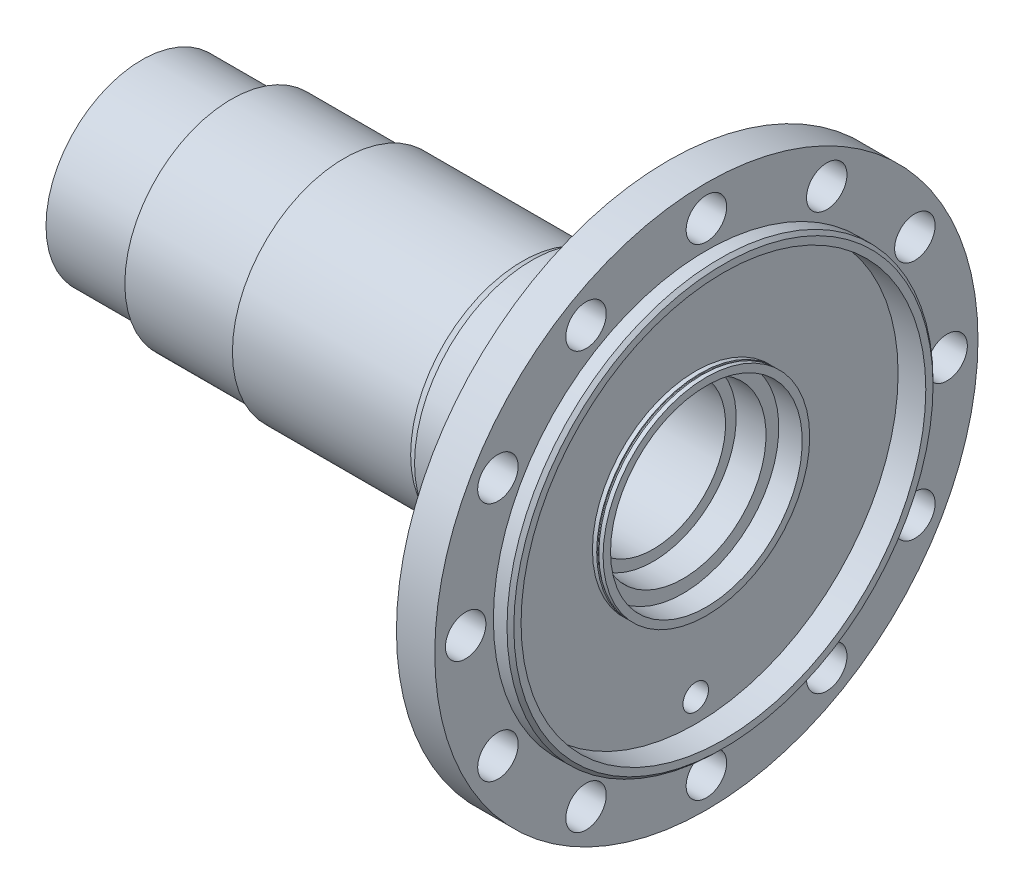
ISO-10303-21;
HEADER;
FILE_DESCRIPTION(('STEP AP214'),'2;1');
FILE_NAME('part.step','',(''),(''),'','','');
FILE_SCHEMA(('AUTOMOTIVE_DESIGN { 1 0 10303 214 1 1 1 1 }'));
ENDSEC;
DATA;
#1=APPLICATION_CONTEXT('core data for automotive mechanical design processes');
#2=APPLICATION_PROTOCOL_DEFINITION('international standard','automotive_design',2000,#1);
#3=PRODUCT_CONTEXT('',#1,'mechanical');
#4=PRODUCT('Part','Part','',(#3));
#5=PRODUCT_RELATED_PRODUCT_CATEGORY('part','',(#4));
#6=PRODUCT_DEFINITION_FORMATION('','',#4);
#7=PRODUCT_DEFINITION_CONTEXT('part definition',#1,'design');
#8=PRODUCT_DEFINITION('design','',#6,#7);
#9=PRODUCT_DEFINITION_SHAPE('','',#8);
#10=(LENGTH_UNIT() NAMED_UNIT(*) SI_UNIT(.MILLI.,.METRE.));
#11=(NAMED_UNIT(*) PLANE_ANGLE_UNIT() SI_UNIT($,.RADIAN.));
#12=(NAMED_UNIT(*) SI_UNIT($,.STERADIAN.) SOLID_ANGLE_UNIT());
#13=UNCERTAINTY_MEASURE_WITH_UNIT(LENGTH_MEASURE(1.E-05),#10,'distance_accuracy_value','');
#14=(GEOMETRIC_REPRESENTATION_CONTEXT(3) GLOBAL_UNCERTAINTY_ASSIGNED_CONTEXT((#13)) GLOBAL_UNIT_ASSIGNED_CONTEXT((#10,
#11,#12)) REPRESENTATION_CONTEXT('',''));
#15=CARTESIAN_POINT('',(0.,0.,0.));
#16=DIRECTION('',(0.,0.,1.));
#17=DIRECTION('',(1.,0.,0.));
#18=AXIS2_PLACEMENT_3D('',#15,#16,#17);
#19=CARTESIAN_POINT('',(265.,45.,0.));
#20=DIRECTION('',(1.,0.,0.));
#21=DIRECTION('',(0.,0.,-1.));
#22=AXIS2_PLACEMENT_3D('',#19,#20,#21);
#23=PLANE('',#22);
#24=CARTESIAN_POINT('',(265.,0.,0.));
#25=DIRECTION('',(-1.,0.,0.));
#26=DIRECTION('',(0.,0.,1.));
#27=AXIS2_PLACEMENT_3D('',#24,#25,#26);
#28=CIRCLE('',#27,45.);
#29=CARTESIAN_POINT('',(265.,0.,45.));
#30=VERTEX_POINT('',#29);
#31=EDGE_CURVE('E198',#30,#30,#28,.T.);
#32=ORIENTED_EDGE('',*,*,#31,.T.);
#33=EDGE_LOOP('',(#32));
#34=FACE_BOUND('',#33,.T.);
#35=CARTESIAN_POINT('',(265.,0.,0.));
#36=DIRECTION('',(-1.,0.,0.));
#37=DIRECTION('',(0.,0.,1.));
#38=AXIS2_PLACEMENT_3D('',#35,#36,#37);
#39=CIRCLE('',#38,48.5);
#40=CARTESIAN_POINT('',(265.,0.,48.5));
#41=VERTEX_POINT('',#40);
#42=EDGE_CURVE('E237',#41,#41,#39,.T.);
#43=ORIENTED_EDGE('',*,*,#42,.F.);
#44=EDGE_LOOP('',(#43));
#45=FACE_BOUND('',#44,.T.);
#46=ADVANCED_FACE('F50',(#34,#45),#23,.T.);
#47=CARTESIAN_POINT('',(0.,0.,0.));
#48=DIRECTION('',(1.,0.,0.));
#49=DIRECTION('',(0.,0.,-1.));
#50=AXIS2_PLACEMENT_3D('',#47,#48,#49);
#51=PLANE('',#50);
#52=CARTESIAN_POINT('',(0.,0.,0.));
#53=DIRECTION('',(-1.,0.,0.));
#54=DIRECTION('',(0.,0.,1.));
#55=AXIS2_PLACEMENT_3D('',#52,#53,#54);
#56=CIRCLE('',#55,31.);
#57=CARTESIAN_POINT('',(0.,0.,31.));
#58=VERTEX_POINT('',#57);
#59=EDGE_CURVE('E159',#58,#58,#56,.T.);
#60=ORIENTED_EDGE('',*,*,#59,.F.);
#61=EDGE_LOOP('',(#60));
#62=FACE_BOUND('',#61,.T.);
#63=CARTESIAN_POINT('',(0.,0.,0.));
#64=DIRECTION('',(-1.,0.,0.));
#65=DIRECTION('',(0.,0.,1.));
#66=AXIS2_PLACEMENT_3D('',#63,#64,#65);
#67=CIRCLE('',#66,45.);
#68=CARTESIAN_POINT('',(0.,0.,45.));
#69=VERTEX_POINT('',#68);
#70=EDGE_CURVE('E11',#69,#69,#67,.T.);
#71=ORIENTED_EDGE('',*,*,#70,.T.);
#72=EDGE_LOOP('',(#71));
#73=FACE_BOUND('',#72,.T.);
#74=ADVANCED_FACE('F53',(#62,#73),#51,.F.);
#75=CARTESIAN_POINT('',(0.,0.,0.));
#76=DIRECTION('',(-1.,0.,0.));
#77=DIRECTION('',(0.,0.,1.));
#78=AXIS2_PLACEMENT_3D('',#75,#76,#77);
#79=CYLINDRICAL_SURFACE('',#78,45.);
#80=ORIENTED_EDGE('',*,*,#70,.F.);
#81=EDGE_LOOP('',(#80));
#82=FACE_BOUND('',#81,.T.);
#83=CARTESIAN_POINT('',(42.,0.,0.));
#84=DIRECTION('',(-1.,0.,0.));
#85=DIRECTION('',(0.,0.,1.));
#86=AXIS2_PLACEMENT_3D('',#83,#84,#85);
#87=CIRCLE('',#86,45.);
#88=CARTESIAN_POINT('',(42.,0.,45.));
#89=VERTEX_POINT('',#88);
#90=EDGE_CURVE('E60',#89,#89,#87,.T.);
#91=ORIENTED_EDGE('',*,*,#90,.T.);
#92=EDGE_LOOP('',(#91));
#93=FACE_BOUND('',#92,.T.);
#94=ADVANCED_FACE('F330',(#82,#93),#79,.T.);
#95=CARTESIAN_POINT('',(42.,45.,0.));
#96=DIRECTION('',(1.,0.,0.));
#97=DIRECTION('',(0.,0.,-1.));
#98=AXIS2_PLACEMENT_3D('',#95,#96,#97);
#99=PLANE('',#98);
#100=ORIENTED_EDGE('',*,*,#90,.F.);
#101=EDGE_LOOP('',(#100));
#102=FACE_BOUND('',#101,.T.);
#103=CARTESIAN_POINT('',(42.,0.,0.));
#104=DIRECTION('',(-1.,0.,0.));
#105=DIRECTION('',(0.,0.,1.));
#106=AXIS2_PLACEMENT_3D('',#103,#104,#105);
#107=CIRCLE('',#106,50.);
#108=CARTESIAN_POINT('',(42.,0.,50.));
#109=VERTEX_POINT('',#108);
#110=EDGE_CURVE('E66',#109,#109,#107,.T.);
#111=ORIENTED_EDGE('',*,*,#110,.T.);
#112=EDGE_LOOP('',(#111));
#113=FACE_BOUND('',#112,.T.);
#114=ADVANCED_FACE('F449',(#102,#113),#99,.F.);
#115=CARTESIAN_POINT('',(0.,0.,0.));
#116=DIRECTION('',(-1.,0.,0.));
#117=DIRECTION('',(0.,0.,1.));
#118=AXIS2_PLACEMENT_3D('',#115,#116,#117);
#119=CYLINDRICAL_SURFACE('',#118,50.);
#120=ORIENTED_EDGE('',*,*,#110,.F.);
#121=EDGE_LOOP('',(#120));
#122=FACE_BOUND('',#121,.T.);
#123=CARTESIAN_POINT('',(95.,0.,0.));
#124=DIRECTION('',(-1.,0.,0.));
#125=DIRECTION('',(0.,0.,1.));
#126=AXIS2_PLACEMENT_3D('',#123,#124,#125);
#127=CIRCLE('',#126,50.);
#128=CARTESIAN_POINT('',(95.,0.,50.));
#129=VERTEX_POINT('',#128);
#130=EDGE_CURVE('E83',#129,#129,#127,.T.);
#131=ORIENTED_EDGE('',*,*,#130,.T.);
#132=EDGE_LOOP('',(#131));
#133=FACE_BOUND('',#132,.T.);
#134=ADVANCED_FACE('F444',(#122,#133),#119,.T.);
#135=CARTESIAN_POINT('',(95.,50.,0.));
#136=DIRECTION('',(1.,0.,0.));
#137=DIRECTION('',(0.,0.,-1.));
#138=AXIS2_PLACEMENT_3D('',#135,#136,#137);
#139=PLANE('',#138);
#140=ORIENTED_EDGE('',*,*,#130,.F.);
#141=EDGE_LOOP('',(#140));
#142=FACE_BOUND('',#141,.T.);
#143=CARTESIAN_POINT('',(95.,0.,0.));
#144=DIRECTION('',(-1.,0.,0.));
#145=DIRECTION('',(0.,0.,1.));
#146=AXIS2_PLACEMENT_3D('',#143,#144,#145);
#147=CIRCLE('',#146,52.5);
#148=CARTESIAN_POINT('',(95.,0.,52.5));
#149=VERTEX_POINT('',#148);
#150=EDGE_CURVE('E88',#149,#149,#147,.T.);
#151=ORIENTED_EDGE('',*,*,#150,.T.);
#152=EDGE_LOOP('',(#151));
#153=FACE_BOUND('',#152,.T.);
#154=ADVANCED_FACE('F439',(#142,#153),#139,.F.);
#155=CARTESIAN_POINT('',(0.,0.,0.));
#156=DIRECTION('',(-1.,0.,0.));
#157=DIRECTION('',(0.,0.,1.));
#158=AXIS2_PLACEMENT_3D('',#155,#156,#157);
#159=CYLINDRICAL_SURFACE('',#158,52.5);
#160=ORIENTED_EDGE('',*,*,#150,.F.);
#161=EDGE_LOOP('',(#160));
#162=FACE_BOUND('',#161,.T.);
#163=CARTESIAN_POINT('',(178.669872981078,0.,0.));
#164=DIRECTION('',(-1.,0.,0.));
#165=DIRECTION('',(0.,0.,1.));
#166=AXIS2_PLACEMENT_3D('',#163,#164,#165);
#167=CIRCLE('',#166,52.5);
#168=CARTESIAN_POINT('',(178.669872981078,0.,52.5));
#169=VERTEX_POINT('',#168);
#170=EDGE_CURVE('E93',#169,#169,#167,.T.);
#171=ORIENTED_EDGE('',*,*,#170,.T.);
#172=EDGE_LOOP('',(#171));
#173=FACE_BOUND('',#172,.T.);
#174=ADVANCED_FACE('F434',(#162,#173),#159,.T.);
#175=CARTESIAN_POINT('',(183.,0.,0.));
#176=DIRECTION('',(1.,0.,0.));
#177=DIRECTION('',(0.,0.,-1.));
#178=AXIS2_PLACEMENT_3D('',#175,#176,#177);
#179=CONICAL_SURFACE('',#178,55.,0.5235987755983);
#180=ORIENTED_EDGE('',*,*,#170,.F.);
#181=EDGE_LOOP('',(#180));
#182=FACE_BOUND('',#181,.T.);
#183=CARTESIAN_POINT('',(183.,0.,0.));
#184=DIRECTION('',(-1.,0.,0.));
#185=DIRECTION('',(0.,0.,1.));
#186=AXIS2_PLACEMENT_3D('',#183,#184,#185);
#187=CIRCLE('',#186,55.);
#188=CARTESIAN_POINT('',(183.,0.,55.));
#189=VERTEX_POINT('',#188);
#190=EDGE_CURVE('E101',#189,#189,#187,.T.);
#191=ORIENTED_EDGE('',*,*,#190,.T.);
#192=EDGE_LOOP('',(#191));
#193=FACE_BOUND('',#192,.T.);
#194=ADVANCED_FACE('F429',(#182,#193),#179,.T.);
#195=CARTESIAN_POINT('',(0.,0.,0.));
#196=DIRECTION('',(-1.,0.,0.));
#197=DIRECTION('',(0.,0.,1.));
#198=AXIS2_PLACEMENT_3D('',#195,#196,#197);
#199=CYLINDRICAL_SURFACE('',#198,55.);
#200=ORIENTED_EDGE('',*,*,#190,.F.);
#201=EDGE_LOOP('',(#200));
#202=FACE_BOUND('',#201,.T.);
#203=CARTESIAN_POINT('',(215.,0.,0.));
#204=DIRECTION('',(-1.,0.,0.));
#205=DIRECTION('',(0.,0.,1.));
#206=AXIS2_PLACEMENT_3D('',#203,#204,#205);
#207=CIRCLE('',#206,55.);
#208=CARTESIAN_POINT('',(215.,0.,55.));
#209=VERTEX_POINT('',#208);
#210=EDGE_CURVE('E105',#209,#209,#207,.T.);
#211=ORIENTED_EDGE('',*,*,#210,.T.);
#212=EDGE_LOOP('',(#211));
#213=FACE_BOUND('',#212,.T.);
#214=ADVANCED_FACE('F424',(#202,#213),#199,.T.);
#215=CARTESIAN_POINT('',(215.,55.,0.));
#216=DIRECTION('',(1.,0.,0.));
#217=DIRECTION('',(0.,0.,-1.));
#218=AXIS2_PLACEMENT_3D('',#215,#216,#217);
#219=PLANE('',#218);
#220=ORIENTED_EDGE('',*,*,#210,.F.);
#221=EDGE_LOOP('',(#220));
#222=FACE_BOUND('',#221,.T.);
#223=CARTESIAN_POINT('',(215.,0.,0.));
#224=DIRECTION('',(-1.,0.,0.));
#225=DIRECTION('',(0.,0.,1.));
#226=AXIS2_PLACEMENT_3D('',#223,#224,#225);
#227=CIRCLE('',#226,62.5);
#228=CARTESIAN_POINT('',(215.,0.,62.5));
#229=VERTEX_POINT('',#228);
#230=EDGE_CURVE('E110',#229,#229,#227,.T.);
#231=ORIENTED_EDGE('',*,*,#230,.T.);
#232=EDGE_LOOP('',(#231));
#233=FACE_BOUND('',#232,.T.);
#234=ADVANCED_FACE('F419',(#222,#233),#219,.F.);
#235=CARTESIAN_POINT('',(0.,0.,0.));
#236=DIRECTION('',(-1.,0.,0.));
#237=DIRECTION('',(0.,0.,1.));
#238=AXIS2_PLACEMENT_3D('',#235,#236,#237);
#239=CYLINDRICAL_SURFACE('',#238,62.5);
#240=ORIENTED_EDGE('',*,*,#230,.F.);
#241=EDGE_LOOP('',(#240));
#242=FACE_BOUND('',#241,.T.);
#243=CARTESIAN_POINT('',(239.,0.,0.));
#244=DIRECTION('',(-1.,0.,0.));
#245=DIRECTION('',(0.,0.,1.));
#246=AXIS2_PLACEMENT_3D('',#243,#244,#245);
#247=CIRCLE('',#246,62.5);
#248=CARTESIAN_POINT('',(239.,0.,62.5));
#249=VERTEX_POINT('',#248);
#250=EDGE_CURVE('E115',#249,#249,#247,.T.);
#251=ORIENTED_EDGE('',*,*,#250,.T.);
#252=EDGE_LOOP('',(#251));
#253=FACE_BOUND('',#252,.T.);
#254=ADVANCED_FACE('F414',(#242,#253),#239,.T.);
#255=CARTESIAN_POINT('',(239.,62.5,0.));
#256=DIRECTION('',(1.,0.,0.));
#257=DIRECTION('',(0.,0.,-1.));
#258=AXIS2_PLACEMENT_3D('',#255,#256,#257);
#259=PLANE('',#258);
#260=CARTESIAN_POINT('',(239.,-84.,0.));
#261=DIRECTION('',(1.,0.,0.));
#262=DIRECTION('',(0.,0.,-1.));
#263=AXIS2_PLACEMENT_3D('',#260,#261,#262);
#264=CIRCLE('',#263,6.);
#265=CARTESIAN_POINT('',(239.,-84.,-6.));
#266=VERTEX_POINT('',#265);
#267=EDGE_CURVE('E301',#266,#266,#264,.F.);
#268=ORIENTED_EDGE('',*,*,#267,.F.);
#269=EDGE_LOOP('',(#268));
#270=FACE_BOUND('',#269,.T.);
#271=ORIENTED_EDGE('',*,*,#250,.F.);
#272=EDGE_LOOP('',(#271));
#273=FACE_BOUND('',#272,.T.);
#274=CARTESIAN_POINT('',(239.,0.,0.));
#275=DIRECTION('',(-1.,0.,0.));
#276=DIRECTION('',(0.,0.,1.));
#277=AXIS2_PLACEMENT_3D('',#274,#275,#276);
#278=CIRCLE('',#277,100.);
#279=CARTESIAN_POINT('',(239.,0.,100.));
#280=VERTEX_POINT('',#279);
#281=EDGE_CURVE('E123',#280,#280,#278,.T.);
#282=ORIENTED_EDGE('',*,*,#281,.T.);
#283=EDGE_LOOP('',(#282));
#284=FACE_BOUND('',#283,.T.);
#285=ADVANCED_FACE('F409',(#270,#273,#284),#259,.F.);
#286=CARTESIAN_POINT('',(0.,0.,0.));
#287=DIRECTION('',(-1.,0.,0.));
#288=DIRECTION('',(0.,0.,1.));
#289=AXIS2_PLACEMENT_3D('',#286,#287,#288);
#290=CYLINDRICAL_SURFACE('',#289,100.);
#291=ORIENTED_EDGE('',*,*,#281,.F.);
#292=EDGE_LOOP('',(#291));
#293=FACE_BOUND('',#292,.T.);
#294=CARTESIAN_POINT('',(247.,0.,0.));
#295=DIRECTION('',(-1.,0.,0.));
#296=DIRECTION('',(0.,0.,1.));
#297=AXIS2_PLACEMENT_3D('',#294,#295,#296);
#298=CIRCLE('',#297,100.);
#299=CARTESIAN_POINT('',(247.,0.,100.));
#300=VERTEX_POINT('',#299);
#301=EDGE_CURVE('E127',#300,#300,#298,.T.);
#302=ORIENTED_EDGE('',*,*,#301,.T.);
#303=EDGE_LOOP('',(#302));
#304=FACE_BOUND('',#303,.T.);
#305=ADVANCED_FACE('F404',(#293,#304),#290,.T.);
#306=CARTESIAN_POINT('',(247.,100.,0.));
#307=DIRECTION('',(1.,0.,0.));
#308=DIRECTION('',(0.,0.,-1.));
#309=AXIS2_PLACEMENT_3D('',#306,#307,#308);
#310=PLANE('',#309);
#311=CARTESIAN_POINT('',(247.,97.8608706276416,-56.5));
#312=DIRECTION('',(1.,0.,0.));
#313=DIRECTION('',(0.,0.,-1.));
#314=AXIS2_PLACEMENT_3D('',#311,#312,#313);
#315=CIRCLE('',#314,9.5);
#316=CARTESIAN_POINT('',(247.,97.8608706276416,-66.));
#317=VERTEX_POINT('',#316);
#318=EDGE_CURVE('E296',#317,#317,#315,.F.);
#319=ORIENTED_EDGE('',*,*,#318,.F.);
#320=EDGE_LOOP('',(#319));
#321=FACE_BOUND('',#320,.T.);
#322=CARTESIAN_POINT('',(247.,56.4999999999999,-97.8608706276416));
#323=DIRECTION('',(1.,0.,0.));
#324=DIRECTION('',(0.,0.,-1.));
#325=AXIS2_PLACEMENT_3D('',#322,#323,#324);
#326=CIRCLE('',#325,9.49999999999999);
#327=CARTESIAN_POINT('',(247.,56.4999999999999,-107.360870627642));
#328=VERTEX_POINT('',#327);
#329=EDGE_CURVE('E291',#328,#328,#326,.F.);
#330=ORIENTED_EDGE('',*,*,#329,.F.);
#331=EDGE_LOOP('',(#330));
#332=FACE_BOUND('',#331,.T.);
#333=CARTESIAN_POINT('',(247.,0.,-113.));
#334=DIRECTION('',(1.,0.,0.));
#335=DIRECTION('',(0.,0.,-1.));
#336=AXIS2_PLACEMENT_3D('',#333,#334,#335);
#337=CIRCLE('',#336,9.49999999999999);
#338=CARTESIAN_POINT('',(247.,0.,-122.5));
#339=VERTEX_POINT('',#338);
#340=EDGE_CURVE('E286',#339,#339,#337,.F.);
#341=ORIENTED_EDGE('',*,*,#340,.F.);
#342=EDGE_LOOP('',(#341));
#343=FACE_BOUND('',#342,.T.);
#344=CARTESIAN_POINT('',(247.,-56.5,-97.8608706276415));
#345=DIRECTION('',(1.,0.,0.));
#346=DIRECTION('',(0.,0.,-1.));
#347=AXIS2_PLACEMENT_3D('',#344,#345,#346);
#348=CIRCLE('',#347,9.49999999999999);
#349=CARTESIAN_POINT('',(247.,-56.5,-107.360870627642));
#350=VERTEX_POINT('',#349);
#351=EDGE_CURVE('E281',#350,#350,#348,.F.);
#352=ORIENTED_EDGE('',*,*,#351,.F.);
#353=EDGE_LOOP('',(#352));
#354=FACE_BOUND('',#353,.T.);
#355=CARTESIAN_POINT('',(247.,-97.8608706276416,-56.5));
#356=DIRECTION('',(1.,0.,0.));
#357=DIRECTION('',(0.,0.,-1.));
#358=AXIS2_PLACEMENT_3D('',#355,#356,#357);
#359=CIRCLE('',#358,9.5);
#360=CARTESIAN_POINT('',(247.,-97.8608706276416,-66.));
#361=VERTEX_POINT('',#360);
#362=EDGE_CURVE('E276',#361,#361,#359,.F.);
#363=ORIENTED_EDGE('',*,*,#362,.F.);
#364=EDGE_LOOP('',(#363));
#365=FACE_BOUND('',#364,.T.);
#366=CARTESIAN_POINT('',(247.,-113.,0.));
#367=DIRECTION('',(1.,0.,0.));
#368=DIRECTION('',(0.,0.,-1.));
#369=AXIS2_PLACEMENT_3D('',#366,#367,#368);
#370=CIRCLE('',#369,9.5);
#371=CARTESIAN_POINT('',(247.,-113.,-9.49999999999998));
#372=VERTEX_POINT('',#371);
#373=EDGE_CURVE('E271',#372,#372,#370,.F.);
#374=ORIENTED_EDGE('',*,*,#373,.F.);
#375=EDGE_LOOP('',(#374));
#376=FACE_BOUND('',#375,.T.);
#377=CARTESIAN_POINT('',(247.,-97.8608706276415,56.5));
#378=DIRECTION('',(1.,0.,0.));
#379=DIRECTION('',(0.,0.,-1.));
#380=AXIS2_PLACEMENT_3D('',#377,#378,#379);
#381=CIRCLE('',#380,9.5);
#382=CARTESIAN_POINT('',(247.,-97.8608706276415,47.));
#383=VERTEX_POINT('',#382);
#384=EDGE_CURVE('E266',#383,#383,#381,.F.);
#385=ORIENTED_EDGE('',*,*,#384,.F.);
#386=EDGE_LOOP('',(#385));
#387=FACE_BOUND('',#386,.T.);
#388=CARTESIAN_POINT('',(247.,-56.5,97.8608706276416));
#389=DIRECTION('',(1.,0.,0.));
#390=DIRECTION('',(0.,0.,-1.));
#391=AXIS2_PLACEMENT_3D('',#388,#389,#390);
#392=CIRCLE('',#391,9.49999999999999);
#393=CARTESIAN_POINT('',(247.,-56.5,88.3608706276416));
#394=VERTEX_POINT('',#393);
#395=EDGE_CURVE('E261',#394,#394,#392,.F.);
#396=ORIENTED_EDGE('',*,*,#395,.F.);
#397=EDGE_LOOP('',(#396));
#398=FACE_BOUND('',#397,.T.);
#399=CARTESIAN_POINT('',(247.,0.,113.));
#400=DIRECTION('',(1.,0.,0.));
#401=DIRECTION('',(0.,0.,-1.));
#402=AXIS2_PLACEMENT_3D('',#399,#400,#401);
#403=CIRCLE('',#402,9.49999999999999);
#404=CARTESIAN_POINT('',(247.,0.,103.5));
#405=VERTEX_POINT('',#404);
#406=EDGE_CURVE('E256',#405,#405,#403,.F.);
#407=ORIENTED_EDGE('',*,*,#406,.F.);
#408=EDGE_LOOP('',(#407));
#409=FACE_BOUND('',#408,.T.);
#410=CARTESIAN_POINT('',(247.,56.5,97.8608706276416));
#411=DIRECTION('',(1.,0.,0.));
#412=DIRECTION('',(0.,0.,-1.));
#413=AXIS2_PLACEMENT_3D('',#410,#411,#412);
#414=CIRCLE('',#413,9.49999999999999);
#415=CARTESIAN_POINT('',(247.,56.5,88.3608706276416));
#416=VERTEX_POINT('',#415);
#417=EDGE_CURVE('E251',#416,#416,#414,.F.);
#418=ORIENTED_EDGE('',*,*,#417,.F.);
#419=EDGE_LOOP('',(#418));
#420=FACE_BOUND('',#419,.T.);
#421=CARTESIAN_POINT('',(247.,97.8608706276416,56.5));
#422=DIRECTION('',(1.,0.,0.));
#423=DIRECTION('',(0.,0.,-1.));
#424=AXIS2_PLACEMENT_3D('',#421,#422,#423);
#425=CIRCLE('',#424,9.5);
#426=CARTESIAN_POINT('',(247.,97.8608706276416,47.));
#427=VERTEX_POINT('',#426);
#428=EDGE_CURVE('E246',#427,#427,#425,.F.);
#429=ORIENTED_EDGE('',*,*,#428,.F.);
#430=EDGE_LOOP('',(#429));
#431=FACE_BOUND('',#430,.T.);
#432=CARTESIAN_POINT('',(247.,113.,0.));
#433=DIRECTION('',(1.,0.,0.));
#434=DIRECTION('',(0.,0.,-1.));
#435=AXIS2_PLACEMENT_3D('',#432,#433,#434);
#436=CIRCLE('',#435,9.5);
#437=CARTESIAN_POINT('',(247.,113.,-9.50000000000001));
#438=VERTEX_POINT('',#437);
#439=EDGE_CURVE('E242',#438,#438,#436,.F.);
#440=ORIENTED_EDGE('',*,*,#439,.F.);
#441=EDGE_LOOP('',(#440));
#442=FACE_BOUND('',#441,.T.);
#443=ORIENTED_EDGE('',*,*,#301,.F.);
#444=EDGE_LOOP('',(#443));
#445=FACE_BOUND('',#444,.T.);
#446=CARTESIAN_POINT('',(247.,0.,0.));
#447=DIRECTION('',(-1.,0.,0.));
#448=DIRECTION('',(0.,0.,1.));
#449=AXIS2_PLACEMENT_3D('',#446,#447,#448);
#450=CIRCLE('',#449,127.5);
#451=CARTESIAN_POINT('',(247.,0.,127.5));
#452=VERTEX_POINT('',#451);
#453=EDGE_CURVE('E132',#452,#452,#450,.T.);
#454=ORIENTED_EDGE('',*,*,#453,.T.);
#455=EDGE_LOOP('',(#454));
#456=FACE_BOUND('',#455,.T.);
#457=ADVANCED_FACE('F399',(#321,#332,#343,#354,#365,#376,#387,#398,#409,#420,#431,#442,#445,
#456),#310,.F.);
#458=CARTESIAN_POINT('',(0.,0.,0.));
#459=DIRECTION('',(-1.,0.,0.));
#460=DIRECTION('',(0.,0.,1.));
#461=AXIS2_PLACEMENT_3D('',#458,#459,#460);
#462=CYLINDRICAL_SURFACE('',#461,127.5);
#463=ORIENTED_EDGE('',*,*,#453,.F.);
#464=EDGE_LOOP('',(#463));
#465=FACE_BOUND('',#464,.T.);
#466=CARTESIAN_POINT('',(265.,0.,0.));
#467=DIRECTION('',(-1.,0.,0.));
#468=DIRECTION('',(0.,0.,1.));
#469=AXIS2_PLACEMENT_3D('',#466,#467,#468);
#470=CIRCLE('',#469,127.5);
#471=CARTESIAN_POINT('',(265.,0.,127.5));
#472=VERTEX_POINT('',#471);
#473=EDGE_CURVE('E137',#472,#472,#470,.T.);
#474=ORIENTED_EDGE('',*,*,#473,.T.);
#475=EDGE_LOOP('',(#474));
#476=FACE_BOUND('',#475,.T.);
#477=ADVANCED_FACE('F394',(#465,#476),#462,.T.);
#478=CARTESIAN_POINT('',(265.,127.5,0.));
#479=DIRECTION('',(-1.,0.,0.));
#480=DIRECTION('',(0.,0.,1.));
#481=AXIS2_PLACEMENT_3D('',#478,#479,#480);
#482=PLANE('',#481);
#483=CARTESIAN_POINT('',(265.,97.8608706276416,-56.5));
#484=DIRECTION('',(-1.,0.,0.));
#485=DIRECTION('',(0.,0.,1.));
#486=AXIS2_PLACEMENT_3D('',#483,#484,#485);
#487=CIRCLE('',#486,9.5);
#488=CARTESIAN_POINT('',(265.,97.8608706276416,-47.));
#489=VERTEX_POINT('',#488);
#490=EDGE_CURVE('E300',#489,#489,#487,.F.);
#491=ORIENTED_EDGE('',*,*,#490,.F.);
#492=EDGE_LOOP('',(#491));
#493=FACE_BOUND('',#492,.T.);
#494=CARTESIAN_POINT('',(265.,56.4999999999999,-97.8608706276416));
#495=DIRECTION('',(-1.,0.,0.));
#496=DIRECTION('',(0.,0.,1.));
#497=AXIS2_PLACEMENT_3D('',#494,#495,#496);
#498=CIRCLE('',#497,9.49999999999999);
#499=CARTESIAN_POINT('',(265.,56.4999999999999,-88.3608706276416));
#500=VERTEX_POINT('',#499);
#501=EDGE_CURVE('E295',#500,#500,#498,.F.);
#502=ORIENTED_EDGE('',*,*,#501,.F.);
#503=EDGE_LOOP('',(#502));
#504=FACE_BOUND('',#503,.T.);
#505=CARTESIAN_POINT('',(265.,0.,-113.));
#506=DIRECTION('',(-1.,0.,0.));
#507=DIRECTION('',(0.,0.,1.));
#508=AXIS2_PLACEMENT_3D('',#505,#506,#507);
#509=CIRCLE('',#508,9.49999999999999);
#510=CARTESIAN_POINT('',(265.,0.,-103.5));
#511=VERTEX_POINT('',#510);
#512=EDGE_CURVE('E290',#511,#511,#509,.F.);
#513=ORIENTED_EDGE('',*,*,#512,.F.);
#514=EDGE_LOOP('',(#513));
#515=FACE_BOUND('',#514,.T.);
#516=CARTESIAN_POINT('',(265.,-56.5,-97.8608706276415));
#517=DIRECTION('',(-1.,0.,0.));
#518=DIRECTION('',(0.,0.,1.));
#519=AXIS2_PLACEMENT_3D('',#516,#517,#518);
#520=CIRCLE('',#519,9.49999999999999);
#521=CARTESIAN_POINT('',(265.,-56.5,-88.3608706276415));
#522=VERTEX_POINT('',#521);
#523=EDGE_CURVE('E285',#522,#522,#520,.F.);
#524=ORIENTED_EDGE('',*,*,#523,.F.);
#525=EDGE_LOOP('',(#524));
#526=FACE_BOUND('',#525,.T.);
#527=CARTESIAN_POINT('',(265.,-97.8608706276416,-56.5));
#528=DIRECTION('',(-1.,0.,0.));
#529=DIRECTION('',(0.,0.,1.));
#530=AXIS2_PLACEMENT_3D('',#527,#528,#529);
#531=CIRCLE('',#530,9.5);
#532=CARTESIAN_POINT('',(265.,-97.8608706276416,-47.));
#533=VERTEX_POINT('',#532);
#534=EDGE_CURVE('E280',#533,#533,#531,.F.);
#535=ORIENTED_EDGE('',*,*,#534,.F.);
#536=EDGE_LOOP('',(#535));
#537=FACE_BOUND('',#536,.T.);
#538=CARTESIAN_POINT('',(265.,-113.,0.));
#539=DIRECTION('',(-1.,0.,0.));
#540=DIRECTION('',(0.,0.,1.));
#541=AXIS2_PLACEMENT_3D('',#538,#539,#540);
#542=CIRCLE('',#541,9.5);
#543=CARTESIAN_POINT('',(265.,-113.,9.50000000000002));
#544=VERTEX_POINT('',#543);
#545=EDGE_CURVE('E275',#544,#544,#542,.F.);
#546=ORIENTED_EDGE('',*,*,#545,.F.);
#547=EDGE_LOOP('',(#546));
#548=FACE_BOUND('',#547,.T.);
#549=CARTESIAN_POINT('',(265.,-97.8608706276415,56.5));
#550=DIRECTION('',(-1.,0.,0.));
#551=DIRECTION('',(0.,0.,1.));
#552=AXIS2_PLACEMENT_3D('',#549,#550,#551);
#553=CIRCLE('',#552,9.5);
#554=CARTESIAN_POINT('',(265.,-97.8608706276415,66.0000000000001));
#555=VERTEX_POINT('',#554);
#556=EDGE_CURVE('E270',#555,#555,#553,.F.);
#557=ORIENTED_EDGE('',*,*,#556,.F.);
#558=EDGE_LOOP('',(#557));
#559=FACE_BOUND('',#558,.T.);
#560=CARTESIAN_POINT('',(265.,-56.5,97.8608706276416));
#561=DIRECTION('',(-1.,0.,0.));
#562=DIRECTION('',(0.,0.,1.));
#563=AXIS2_PLACEMENT_3D('',#560,#561,#562);
#564=CIRCLE('',#563,9.49999999999999);
#565=CARTESIAN_POINT('',(265.,-56.5,107.360870627642));
#566=VERTEX_POINT('',#565);
#567=EDGE_CURVE('E265',#566,#566,#564,.F.);
#568=ORIENTED_EDGE('',*,*,#567,.F.);
#569=EDGE_LOOP('',(#568));
#570=FACE_BOUND('',#569,.T.);
#571=CARTESIAN_POINT('',(265.,0.,113.));
#572=DIRECTION('',(-1.,0.,0.));
#573=DIRECTION('',(0.,0.,1.));
#574=AXIS2_PLACEMENT_3D('',#571,#572,#573);
#575=CIRCLE('',#574,9.49999999999999);
#576=CARTESIAN_POINT('',(265.,0.,122.5));
#577=VERTEX_POINT('',#576);
#578=EDGE_CURVE('E260',#577,#577,#575,.F.);
#579=ORIENTED_EDGE('',*,*,#578,.F.);
#580=EDGE_LOOP('',(#579));
#581=FACE_BOUND('',#580,.T.);
#582=CARTESIAN_POINT('',(265.,56.5,97.8608706276416));
#583=DIRECTION('',(-1.,0.,0.));
#584=DIRECTION('',(0.,0.,1.));
#585=AXIS2_PLACEMENT_3D('',#582,#583,#584);
#586=CIRCLE('',#585,9.49999999999999);
#587=CARTESIAN_POINT('',(265.,56.5,107.360870627642));
#588=VERTEX_POINT('',#587);
#589=EDGE_CURVE('E255',#588,#588,#586,.F.);
#590=ORIENTED_EDGE('',*,*,#589,.F.);
#591=EDGE_LOOP('',(#590));
#592=FACE_BOUND('',#591,.T.);
#593=CARTESIAN_POINT('',(265.,97.8608706276416,56.5));
#594=DIRECTION('',(-1.,0.,0.));
#595=DIRECTION('',(0.,0.,1.));
#596=AXIS2_PLACEMENT_3D('',#593,#594,#595);
#597=CIRCLE('',#596,9.5);
#598=CARTESIAN_POINT('',(265.,97.8608706276416,66.));
#599=VERTEX_POINT('',#598);
#600=EDGE_CURVE('E250',#599,#599,#597,.F.);
#601=ORIENTED_EDGE('',*,*,#600,.F.);
#602=EDGE_LOOP('',(#601));
#603=FACE_BOUND('',#602,.T.);
#604=CARTESIAN_POINT('',(265.,113.,0.));
#605=DIRECTION('',(-1.,0.,0.));
#606=DIRECTION('',(0.,0.,1.));
#607=AXIS2_PLACEMENT_3D('',#604,#605,#606);
#608=CIRCLE('',#607,9.5);
#609=CARTESIAN_POINT('',(265.,113.,9.49999999999999));
#610=VERTEX_POINT('',#609);
#611=EDGE_CURVE('E72',#610,#610,#608,.F.);
#612=ORIENTED_EDGE('',*,*,#611,.F.);
#613=EDGE_LOOP('',(#612));
#614=FACE_BOUND('',#613,.T.);
#615=ORIENTED_EDGE('',*,*,#473,.F.);
#616=EDGE_LOOP('',(#615));
#617=FACE_BOUND('',#616,.T.);
#618=CARTESIAN_POINT('',(265.,0.,0.));
#619=DIRECTION('',(-1.,0.,0.));
#620=DIRECTION('',(0.,0.,1.));
#621=AXIS2_PLACEMENT_3D('',#618,#619,#620);
#622=CIRCLE('',#621,100.);
#623=CARTESIAN_POINT('',(265.,0.,100.));
#624=VERTEX_POINT('',#623);
#625=EDGE_CURVE('E145',#624,#624,#622,.T.);
#626=ORIENTED_EDGE('',*,*,#625,.T.);
#627=EDGE_LOOP('',(#626));
#628=FACE_BOUND('',#627,.T.);
#629=ADVANCED_FACE('F389',(#493,#504,#515,#526,#537,#548,#559,#570,#581,#592,#603,#614,#617,
#628),#482,.F.);
#630=CARTESIAN_POINT('',(0.,0.,0.));
#631=DIRECTION('',(-1.,0.,0.));
#632=DIRECTION('',(0.,0.,1.));
#633=AXIS2_PLACEMENT_3D('',#630,#631,#632);
#634=CYLINDRICAL_SURFACE('',#633,100.);
#635=ORIENTED_EDGE('',*,*,#625,.F.);
#636=EDGE_LOOP('',(#635));
#637=FACE_BOUND('',#636,.T.);
#638=CARTESIAN_POINT('',(271.4,0.,0.));
#639=DIRECTION('',(-1.,0.,0.));
#640=DIRECTION('',(0.,0.,1.));
#641=AXIS2_PLACEMENT_3D('',#638,#639,#640);
#642=CIRCLE('',#641,100.);
#643=CARTESIAN_POINT('',(271.4,0.,100.));
#644=VERTEX_POINT('',#643);
#645=EDGE_CURVE('E149',#644,#644,#642,.T.);
#646=ORIENTED_EDGE('',*,*,#645,.T.);
#647=EDGE_LOOP('',(#646));
#648=FACE_BOUND('',#647,.T.);
#649=ADVANCED_FACE('F384',(#637,#648),#634,.T.);
#650=CARTESIAN_POINT('',(273.,0.,0.));
#651=DIRECTION('',(-1.,0.,0.));
#652=DIRECTION('',(0.,0.,1.));
#653=AXIS2_PLACEMENT_3D('',#650,#651,#652);
#654=CONICAL_SURFACE('',#653,98.4,0.785398163397435);
#655=ORIENTED_EDGE('',*,*,#645,.F.);
#656=EDGE_LOOP('',(#655));
#657=FACE_BOUND('',#656,.T.);
#658=CARTESIAN_POINT('',(273.,0.,0.));
#659=DIRECTION('',(-1.,0.,0.));
#660=DIRECTION('',(0.,0.,1.));
#661=AXIS2_PLACEMENT_3D('',#658,#659,#660);
#662=CIRCLE('',#661,98.4);
#663=CARTESIAN_POINT('',(273.,0.,98.4));
#664=VERTEX_POINT('',#663);
#665=EDGE_CURVE('E154',#664,#664,#662,.T.);
#666=ORIENTED_EDGE('',*,*,#665,.T.);
#667=EDGE_LOOP('',(#666));
#668=FACE_BOUND('',#667,.T.);
#669=ADVANCED_FACE('F379',(#657,#668),#654,.T.);
#670=CARTESIAN_POINT('',(273.,98.4,0.));
#671=DIRECTION('',(-1.,0.,0.));
#672=DIRECTION('',(0.,0.,1.));
#673=AXIS2_PLACEMENT_3D('',#670,#671,#672);
#674=PLANE('',#673);
#675=CARTESIAN_POINT('',(273.,0.,0.));
#676=DIRECTION('',(-1.,0.,0.));
#677=DIRECTION('',(0.,0.,1.));
#678=AXIS2_PLACEMENT_3D('',#675,#676,#677);
#679=CIRCLE('',#678,95.);
#680=CARTESIAN_POINT('',(273.,0.,95.));
#681=VERTEX_POINT('',#680);
#682=EDGE_CURVE('E203',#681,#681,#679,.T.);
#683=ORIENTED_EDGE('',*,*,#682,.T.);
#684=EDGE_LOOP('',(#683));
#685=FACE_BOUND('',#684,.T.);
#686=ORIENTED_EDGE('',*,*,#665,.F.);
#687=EDGE_LOOP('',(#686));
#688=FACE_BOUND('',#687,.T.);
#689=ADVANCED_FACE('F374',(#685,#688),#674,.F.);
#690=CARTESIAN_POINT('',(0.,0.,0.));
#691=DIRECTION('',(-1.,0.,0.));
#692=DIRECTION('',(0.,0.,1.));
#693=AXIS2_PLACEMENT_3D('',#690,#691,#692);
#694=CYLINDRICAL_SURFACE('',#693,31.);
#695=ORIENTED_EDGE('',*,*,#59,.T.);
#696=EDGE_LOOP('',(#695));
#697=FACE_BOUND('',#696,.T.);
#698=CARTESIAN_POINT('',(203.5,0.,0.));
#699=DIRECTION('',(-1.,0.,0.));
#700=DIRECTION('',(0.,0.,1.));
#701=AXIS2_PLACEMENT_3D('',#698,#699,#700);
#702=CIRCLE('',#701,31.);
#703=CARTESIAN_POINT('',(203.5,0.,31.));
#704=VERTEX_POINT('',#703);
#705=EDGE_CURVE('E167',#704,#704,#702,.T.);
#706=ORIENTED_EDGE('',*,*,#705,.F.);
#707=EDGE_LOOP('',(#706));
#708=FACE_BOUND('',#707,.T.);
#709=ADVANCED_FACE('F369',(#697,#708),#694,.F.);
#710=CARTESIAN_POINT('',(203.5,31.,0.));
#711=DIRECTION('',(1.,0.,0.));
#712=DIRECTION('',(0.,0.,-1.));
#713=AXIS2_PLACEMENT_3D('',#710,#711,#712);
#714=PLANE('',#713);
#715=ORIENTED_EDGE('',*,*,#705,.T.);
#716=EDGE_LOOP('',(#715));
#717=FACE_BOUND('',#716,.T.);
#718=CARTESIAN_POINT('',(203.5,0.,0.));
#719=DIRECTION('',(-1.,0.,0.));
#720=DIRECTION('',(0.,0.,1.));
#721=AXIS2_PLACEMENT_3D('',#718,#719,#720);
#722=CIRCLE('',#721,34.);
#723=CARTESIAN_POINT('',(203.5,0.,34.));
#724=VERTEX_POINT('',#723);
#725=EDGE_CURVE('E171',#724,#724,#722,.T.);
#726=ORIENTED_EDGE('',*,*,#725,.F.);
#727=EDGE_LOOP('',(#726));
#728=FACE_BOUND('',#727,.T.);
#729=ADVANCED_FACE('F364',(#717,#728),#714,.T.);
#730=CARTESIAN_POINT('',(0.,0.,0.));
#731=DIRECTION('',(-1.,0.,0.));
#732=DIRECTION('',(0.,0.,1.));
#733=AXIS2_PLACEMENT_3D('',#730,#731,#732);
#734=CYLINDRICAL_SURFACE('',#733,34.);
#735=ORIENTED_EDGE('',*,*,#725,.T.);
#736=EDGE_LOOP('',(#735));
#737=FACE_BOUND('',#736,.T.);
#738=CARTESIAN_POINT('',(240.,0.,0.));
#739=DIRECTION('',(-1.,0.,0.));
#740=DIRECTION('',(0.,0.,1.));
#741=AXIS2_PLACEMENT_3D('',#738,#739,#740);
#742=CIRCLE('',#741,34.);
#743=CARTESIAN_POINT('',(240.,0.,34.));
#744=VERTEX_POINT('',#743);
#745=EDGE_CURVE('E176',#744,#744,#742,.T.);
#746=ORIENTED_EDGE('',*,*,#745,.F.);
#747=EDGE_LOOP('',(#746));
#748=FACE_BOUND('',#747,.T.);
#749=ADVANCED_FACE('F359',(#737,#748),#734,.F.);
#750=CARTESIAN_POINT('',(240.,34.,0.));
#751=DIRECTION('',(1.,0.,0.));
#752=DIRECTION('',(0.,0.,-1.));
#753=AXIS2_PLACEMENT_3D('',#750,#751,#752);
#754=PLANE('',#753);
#755=ORIENTED_EDGE('',*,*,#745,.T.);
#756=EDGE_LOOP('',(#755));
#757=FACE_BOUND('',#756,.T.);
#758=CARTESIAN_POINT('',(240.,0.,0.));
#759=DIRECTION('',(-1.,0.,0.));
#760=DIRECTION('',(0.,0.,1.));
#761=AXIS2_PLACEMENT_3D('',#758,#759,#760);
#762=CIRCLE('',#761,39.);
#763=CARTESIAN_POINT('',(240.,0.,39.));
#764=VERTEX_POINT('',#763);
#765=EDGE_CURVE('E181',#764,#764,#762,.T.);
#766=ORIENTED_EDGE('',*,*,#765,.F.);
#767=EDGE_LOOP('',(#766));
#768=FACE_BOUND('',#767,.T.);
#769=ADVANCED_FACE('F354',(#757,#768),#754,.T.);
#770=CARTESIAN_POINT('',(0.,0.,0.));
#771=DIRECTION('',(-1.,0.,0.));
#772=DIRECTION('',(0.,0.,1.));
#773=AXIS2_PLACEMENT_3D('',#770,#771,#772);
#774=CYLINDRICAL_SURFACE('',#773,39.);
#775=ORIENTED_EDGE('',*,*,#765,.T.);
#776=EDGE_LOOP('',(#775));
#777=FACE_BOUND('',#776,.T.);
#778=CARTESIAN_POINT('',(254.,0.,0.));
#779=DIRECTION('',(-1.,0.,0.));
#780=DIRECTION('',(0.,0.,1.));
#781=AXIS2_PLACEMENT_3D('',#778,#779,#780);
#782=CIRCLE('',#781,39.);
#783=CARTESIAN_POINT('',(254.,0.,39.));
#784=VERTEX_POINT('',#783);
#785=EDGE_CURVE('E189',#784,#784,#782,.T.);
#786=ORIENTED_EDGE('',*,*,#785,.F.);
#787=EDGE_LOOP('',(#786));
#788=FACE_BOUND('',#787,.T.);
#789=ADVANCED_FACE('F349',(#777,#788),#774,.F.);
#790=CARTESIAN_POINT('',(254.,39.,0.));
#791=DIRECTION('',(1.,0.,0.));
#792=DIRECTION('',(0.,0.,-1.));
#793=AXIS2_PLACEMENT_3D('',#790,#791,#792);
#794=PLANE('',#793);
#795=ORIENTED_EDGE('',*,*,#785,.T.);
#796=EDGE_LOOP('',(#795));
#797=FACE_BOUND('',#796,.T.);
#798=CARTESIAN_POINT('',(254.,0.,0.));
#799=DIRECTION('',(-1.,0.,0.));
#800=DIRECTION('',(0.,0.,1.));
#801=AXIS2_PLACEMENT_3D('',#798,#799,#800);
#802=CIRCLE('',#801,45.);
#803=CARTESIAN_POINT('',(254.,0.,45.));
#804=VERTEX_POINT('',#803);
#805=EDGE_CURVE('E193',#804,#804,#802,.T.);
#806=ORIENTED_EDGE('',*,*,#805,.F.);
#807=EDGE_LOOP('',(#806));
#808=FACE_BOUND('',#807,.T.);
#809=ADVANCED_FACE('F344',(#797,#808),#794,.T.);
#810=CARTESIAN_POINT('',(0.,0.,0.));
#811=DIRECTION('',(-1.,0.,0.));
#812=DIRECTION('',(0.,0.,1.));
#813=AXIS2_PLACEMENT_3D('',#810,#811,#812);
#814=CYLINDRICAL_SURFACE('',#813,45.);
#815=ORIENTED_EDGE('',*,*,#805,.T.);
#816=EDGE_LOOP('',(#815));
#817=FACE_BOUND('',#816,.T.);
#818=ORIENTED_EDGE('',*,*,#31,.F.);
#819=EDGE_LOOP('',(#818));
#820=FACE_BOUND('',#819,.T.);
#821=ADVANCED_FACE('F340',(#817,#820),#814,.F.);
#822=CARTESIAN_POINT('',(0.,0.,0.));
#823=DIRECTION('',(-1.,0.,0.));
#824=DIRECTION('',(0.,0.,1.));
#825=AXIS2_PLACEMENT_3D('',#822,#823,#824);
#826=CYLINDRICAL_SURFACE('',#825,95.);
#827=ORIENTED_EDGE('',*,*,#682,.F.);
#828=EDGE_LOOP('',(#827));
#829=FACE_BOUND('',#828,.T.);
#830=CARTESIAN_POINT('',(260.,0.,0.));
#831=DIRECTION('',(-1.,0.,0.));
#832=DIRECTION('',(0.,0.,1.));
#833=AXIS2_PLACEMENT_3D('',#830,#831,#832);
#834=CIRCLE('',#833,95.);
#835=CARTESIAN_POINT('',(260.,0.,95.));
#836=VERTEX_POINT('',#835);
#837=EDGE_CURVE('E215',#836,#836,#834,.T.);
#838=ORIENTED_EDGE('',*,*,#837,.T.);
#839=EDGE_LOOP('',(#838));
#840=FACE_BOUND('',#839,.T.);
#841=ADVANCED_FACE('F337',(#829,#840),#826,.F.);
#842=CARTESIAN_POINT('',(0.,0.,0.));
#843=DIRECTION('',(-1.,0.,0.));
#844=DIRECTION('',(0.,0.,1.));
#845=AXIS2_PLACEMENT_3D('',#842,#843,#844);
#846=CYLINDRICAL_SURFACE('',#845,48.5);
#847=ORIENTED_EDGE('',*,*,#42,.T.);
#848=EDGE_LOOP('',(#847));
#849=FACE_BOUND('',#848,.T.);
#850=CARTESIAN_POINT('',(263.,0.,0.));
#851=DIRECTION('',(-1.,0.,0.));
#852=DIRECTION('',(0.,0.,1.));
#853=AXIS2_PLACEMENT_3D('',#850,#851,#852);
#854=CIRCLE('',#853,48.5);
#855=CARTESIAN_POINT('',(263.,0.,48.5));
#856=VERTEX_POINT('',#855);
#857=EDGE_CURVE('E233',#856,#856,#854,.T.);
#858=ORIENTED_EDGE('',*,*,#857,.F.);
#859=EDGE_LOOP('',(#858));
#860=FACE_BOUND('',#859,.T.);
#861=ADVANCED_FACE('F575',(#849,#860),#846,.T.);
#862=CARTESIAN_POINT('',(263.,48.,0.));
#863=DIRECTION('',(-1.,0.,0.));
#864=DIRECTION('',(0.,0.,1.));
#865=AXIS2_PLACEMENT_3D('',#862,#863,#864);
#866=PLANE('',#865);
#867=CARTESIAN_POINT('',(263.,0.,0.));
#868=DIRECTION('',(-1.,0.,0.));
#869=DIRECTION('',(0.,0.,1.));
#870=AXIS2_PLACEMENT_3D('',#867,#868,#869);
#871=CIRCLE('',#870,48.);
#872=CARTESIAN_POINT('',(263.,0.,48.));
#873=VERTEX_POINT('',#872);
#874=EDGE_CURVE('E224',#873,#873,#871,.T.);
#875=ORIENTED_EDGE('',*,*,#874,.F.);
#876=EDGE_LOOP('',(#875));
#877=FACE_BOUND('',#876,.T.);
#878=ORIENTED_EDGE('',*,*,#857,.T.);
#879=EDGE_LOOP('',(#878));
#880=FACE_BOUND('',#879,.T.);
#881=ADVANCED_FACE('F578',(#877,#880),#866,.T.);
#882=CARTESIAN_POINT('',(260.,95.,0.));
#883=DIRECTION('',(1.,0.,0.));
#884=DIRECTION('',(0.,0.,-1.));
#885=AXIS2_PLACEMENT_3D('',#882,#883,#884);
#886=PLANE('',#885);
#887=CARTESIAN_POINT('',(260.,-84.,0.));
#888=DIRECTION('',(1.,0.,0.));
#889=DIRECTION('',(0.,0.,-1.));
#890=AXIS2_PLACEMENT_3D('',#887,#888,#889);
#891=CIRCLE('',#890,6.);
#892=CARTESIAN_POINT('',(260.,-84.,-6.));
#893=VERTEX_POINT('',#892);
#894=EDGE_CURVE('E55',#893,#893,#891,.F.);
#895=ORIENTED_EDGE('',*,*,#894,.T.);
#896=EDGE_LOOP('',(#895));
#897=FACE_BOUND('',#896,.T.);
#898=CARTESIAN_POINT('',(260.,0.,0.));
#899=DIRECTION('',(-1.,0.,0.));
#900=DIRECTION('',(0.,0.,1.));
#901=AXIS2_PLACEMENT_3D('',#898,#899,#900);
#902=CIRCLE('',#901,48.5);
#903=CARTESIAN_POINT('',(260.,0.,48.5));
#904=VERTEX_POINT('',#903);
#905=EDGE_CURVE('E211',#904,#904,#902,.T.);
#906=ORIENTED_EDGE('',*,*,#905,.T.);
#907=EDGE_LOOP('',(#906));
#908=FACE_BOUND('',#907,.T.);
#909=ORIENTED_EDGE('',*,*,#837,.F.);
#910=EDGE_LOOP('',(#909));
#911=FACE_BOUND('',#910,.T.);
#912=ADVANCED_FACE('F312',(#897,#908,#911),#886,.T.);
#913=CARTESIAN_POINT('',(0.,0.,0.));
#914=DIRECTION('',(-1.,0.,0.));
#915=DIRECTION('',(0.,0.,1.));
#916=AXIS2_PLACEMENT_3D('',#913,#914,#915);
#917=CYLINDRICAL_SURFACE('',#916,48.5);
#918=CARTESIAN_POINT('',(262.,0.,0.));
#919=DIRECTION('',(1.,0.,0.));
#920=DIRECTION('',(0.,0.,-1.));
#921=AXIS2_PLACEMENT_3D('',#918,#919,#920);
#922=CIRCLE('',#921,48.5);
#923=CARTESIAN_POINT('',(262.,0.,-48.5));
#924=VERTEX_POINT('',#923);
#925=EDGE_CURVE('E220',#924,#924,#922,.F.);
#926=ORIENTED_EDGE('',*,*,#925,.T.);
#927=EDGE_LOOP('',(#926));
#928=FACE_BOUND('',#927,.T.);
#929=ORIENTED_EDGE('',*,*,#905,.F.);
#930=EDGE_LOOP('',(#929));
#931=FACE_BOUND('',#930,.T.);
#932=ADVANCED_FACE('F589',(#928,#931),#917,.T.);
#933=CARTESIAN_POINT('',(262.5,0.,0.));
#934=DIRECTION('',(-1.,0.,0.));
#935=DIRECTION('',(0.,0.,1.));
#936=AXIS2_PLACEMENT_3D('',#933,#934,#935);
#937=TOROIDAL_SURFACE('',#936,48.,0.500000000000004);
#938=ORIENTED_EDGE('',*,*,#874,.T.);
#939=EDGE_LOOP('',(#938));
#940=FACE_BOUND('',#939,.T.);
#941=CARTESIAN_POINT('',(262.,0.,0.));
#942=DIRECTION('',(-1.,0.,0.));
#943=DIRECTION('',(0.,0.,1.));
#944=AXIS2_PLACEMENT_3D('',#941,#942,#943);
#945=CIRCLE('',#944,48.);
#946=CARTESIAN_POINT('',(262.,0.,48.));
#947=VERTEX_POINT('',#946);
#948=EDGE_CURVE('E229',#947,#947,#945,.T.);
#949=ORIENTED_EDGE('',*,*,#948,.F.);
#950=EDGE_LOOP('',(#949));
#951=FACE_BOUND('',#950,.T.);
#952=ADVANCED_FACE('F566',(#940,#951),#937,.F.);
#953=CARTESIAN_POINT('',(262.,95.,0.));
#954=DIRECTION('',(1.,0.,0.));
#955=DIRECTION('',(0.,0.,-1.));
#956=AXIS2_PLACEMENT_3D('',#953,#954,#955);
#957=PLANE('',#956);
#958=ORIENTED_EDGE('',*,*,#925,.F.);
#959=EDGE_LOOP('',(#958));
#960=FACE_BOUND('',#959,.T.);
#961=ORIENTED_EDGE('',*,*,#948,.T.);
#962=EDGE_LOOP('',(#961));
#963=FACE_BOUND('',#962,.T.);
#964=ADVANCED_FACE('F551',(#960,#963),#957,.T.);
#965=CARTESIAN_POINT('',(273.,113.,0.));
#966=DIRECTION('',(-1.,0.,0.));
#967=DIRECTION('',(0.,0.,1.));
#968=AXIS2_PLACEMENT_3D('',#965,#966,#967);
#969=CYLINDRICAL_SURFACE('',#968,9.5);
#970=ORIENTED_EDGE('',*,*,#611,.T.);
#971=EDGE_LOOP('',(#970));
#972=FACE_BOUND('',#971,.T.);
#973=ORIENTED_EDGE('',*,*,#439,.T.);
#974=EDGE_LOOP('',(#973));
#975=FACE_BOUND('',#974,.T.);
#976=ADVANCED_FACE('F547',(#972,#975),#969,.F.);
#977=CARTESIAN_POINT('',(273.,97.8608706276416,56.5));
#978=DIRECTION('',(-1.,0.,0.));
#979=DIRECTION('',(0.,0.,1.));
#980=AXIS2_PLACEMENT_3D('',#977,#978,#979);
#981=CYLINDRICAL_SURFACE('',#980,9.5);
#982=ORIENTED_EDGE('',*,*,#600,.T.);
#983=EDGE_LOOP('',(#982));
#984=FACE_BOUND('',#983,.T.);
#985=ORIENTED_EDGE('',*,*,#428,.T.);
#986=EDGE_LOOP('',(#985));
#987=FACE_BOUND('',#986,.T.);
#988=ADVANCED_FACE('F550',(#984,#987),#981,.F.);
#989=CARTESIAN_POINT('',(273.,56.5,97.8608706276416));
#990=DIRECTION('',(-1.,0.,0.));
#991=DIRECTION('',(0.,0.,1.));
#992=AXIS2_PLACEMENT_3D('',#989,#990,#991);
#993=CYLINDRICAL_SURFACE('',#992,9.49999999999999);
#994=ORIENTED_EDGE('',*,*,#589,.T.);
#995=EDGE_LOOP('',(#994));
#996=FACE_BOUND('',#995,.T.);
#997=ORIENTED_EDGE('',*,*,#417,.T.);
#998=EDGE_LOOP('',(#997));
#999=FACE_BOUND('',#998,.T.);
#1000=ADVANCED_FACE('F563',(#996,#999),#993,.F.);
#1001=CARTESIAN_POINT('',(273.,0.,113.));
#1002=DIRECTION('',(-1.,0.,0.));
#1003=DIRECTION('',(0.,0.,1.));
#1004=AXIS2_PLACEMENT_3D('',#1001,#1002,#1003);
#1005=CYLINDRICAL_SURFACE('',#1004,9.49999999999999);
#1006=ORIENTED_EDGE('',*,*,#578,.T.);
#1007=EDGE_LOOP('',(#1006));
#1008=FACE_BOUND('',#1007,.T.);
#1009=ORIENTED_EDGE('',*,*,#406,.T.);
#1010=EDGE_LOOP('',(#1009));
#1011=FACE_BOUND('',#1010,.T.);
#1012=ADVANCED_FACE('F650',(#1008,#1011),#1005,.F.);
#1013=CARTESIAN_POINT('',(273.,-56.5,97.8608706276416));
#1014=DIRECTION('',(-1.,0.,0.));
#1015=DIRECTION('',(0.,0.,1.));
#1016=AXIS2_PLACEMENT_3D('',#1013,#1014,#1015);
#1017=CYLINDRICAL_SURFACE('',#1016,9.49999999999999);
#1018=ORIENTED_EDGE('',*,*,#567,.T.);
#1019=EDGE_LOOP('',(#1018));
#1020=FACE_BOUND('',#1019,.T.);
#1021=ORIENTED_EDGE('',*,*,#395,.T.);
#1022=EDGE_LOOP('',(#1021));
#1023=FACE_BOUND('',#1022,.T.);
#1024=ADVANCED_FACE('F659',(#1020,#1023),#1017,.F.);
#1025=CARTESIAN_POINT('',(273.,-97.8608706276415,56.5));
#1026=DIRECTION('',(-1.,0.,0.));
#1027=DIRECTION('',(0.,0.,1.));
#1028=AXIS2_PLACEMENT_3D('',#1025,#1026,#1027);
#1029=CYLINDRICAL_SURFACE('',#1028,9.5);
#1030=ORIENTED_EDGE('',*,*,#556,.T.);
#1031=EDGE_LOOP('',(#1030));
#1032=FACE_BOUND('',#1031,.T.);
#1033=ORIENTED_EDGE('',*,*,#384,.T.);
#1034=EDGE_LOOP('',(#1033));
#1035=FACE_BOUND('',#1034,.T.);
#1036=ADVANCED_FACE('F669',(#1032,#1035),#1029,.F.);
#1037=CARTESIAN_POINT('',(273.,-113.,0.));
#1038=DIRECTION('',(-1.,0.,0.));
#1039=DIRECTION('',(0.,0.,1.));
#1040=AXIS2_PLACEMENT_3D('',#1037,#1038,#1039);
#1041=CYLINDRICAL_SURFACE('',#1040,9.5);
#1042=ORIENTED_EDGE('',*,*,#545,.T.);
#1043=EDGE_LOOP('',(#1042));
#1044=FACE_BOUND('',#1043,.T.);
#1045=ORIENTED_EDGE('',*,*,#373,.T.);
#1046=EDGE_LOOP('',(#1045));
#1047=FACE_BOUND('',#1046,.T.);
#1048=ADVANCED_FACE('F679',(#1044,#1047),#1041,.F.);
#1049=CARTESIAN_POINT('',(273.,-97.8608706276416,-56.5));
#1050=DIRECTION('',(-1.,0.,0.));
#1051=DIRECTION('',(0.,0.,1.));
#1052=AXIS2_PLACEMENT_3D('',#1049,#1050,#1051);
#1053=CYLINDRICAL_SURFACE('',#1052,9.5);
#1054=ORIENTED_EDGE('',*,*,#534,.T.);
#1055=EDGE_LOOP('',(#1054));
#1056=FACE_BOUND('',#1055,.T.);
#1057=ORIENTED_EDGE('',*,*,#362,.T.);
#1058=EDGE_LOOP('',(#1057));
#1059=FACE_BOUND('',#1058,.T.);
#1060=ADVANCED_FACE('F689',(#1056,#1059),#1053,.F.);
#1061=CARTESIAN_POINT('',(273.,-56.5,-97.8608706276415));
#1062=DIRECTION('',(-1.,0.,0.));
#1063=DIRECTION('',(0.,0.,1.));
#1064=AXIS2_PLACEMENT_3D('',#1061,#1062,#1063);
#1065=CYLINDRICAL_SURFACE('',#1064,9.49999999999999);
#1066=ORIENTED_EDGE('',*,*,#523,.T.);
#1067=EDGE_LOOP('',(#1066));
#1068=FACE_BOUND('',#1067,.T.);
#1069=ORIENTED_EDGE('',*,*,#351,.T.);
#1070=EDGE_LOOP('',(#1069));
#1071=FACE_BOUND('',#1070,.T.);
#1072=ADVANCED_FACE('F699',(#1068,#1071),#1065,.F.);
#1073=CARTESIAN_POINT('',(273.,0.,-113.));
#1074=DIRECTION('',(-1.,0.,0.));
#1075=DIRECTION('',(0.,0.,1.));
#1076=AXIS2_PLACEMENT_3D('',#1073,#1074,#1075);
#1077=CYLINDRICAL_SURFACE('',#1076,9.49999999999999);
#1078=ORIENTED_EDGE('',*,*,#512,.T.);
#1079=EDGE_LOOP('',(#1078));
#1080=FACE_BOUND('',#1079,.T.);
#1081=ORIENTED_EDGE('',*,*,#340,.T.);
#1082=EDGE_LOOP('',(#1081));
#1083=FACE_BOUND('',#1082,.T.);
#1084=ADVANCED_FACE('F709',(#1080,#1083),#1077,.F.);
#1085=CARTESIAN_POINT('',(273.,56.4999999999999,-97.8608706276416));
#1086=DIRECTION('',(-1.,0.,0.));
#1087=DIRECTION('',(0.,0.,1.));
#1088=AXIS2_PLACEMENT_3D('',#1085,#1086,#1087);
#1089=CYLINDRICAL_SURFACE('',#1088,9.49999999999999);
#1090=ORIENTED_EDGE('',*,*,#501,.T.);
#1091=EDGE_LOOP('',(#1090));
#1092=FACE_BOUND('',#1091,.T.);
#1093=ORIENTED_EDGE('',*,*,#329,.T.);
#1094=EDGE_LOOP('',(#1093));
#1095=FACE_BOUND('',#1094,.T.);
#1096=ADVANCED_FACE('F321',(#1092,#1095),#1089,.F.);
#1097=CARTESIAN_POINT('',(273.,97.8608706276416,-56.5));
#1098=DIRECTION('',(-1.,0.,0.));
#1099=DIRECTION('',(0.,0.,1.));
#1100=AXIS2_PLACEMENT_3D('',#1097,#1098,#1099);
#1101=CYLINDRICAL_SURFACE('',#1100,9.5);
#1102=ORIENTED_EDGE('',*,*,#490,.T.);
#1103=EDGE_LOOP('',(#1102));
#1104=FACE_BOUND('',#1103,.T.);
#1105=ORIENTED_EDGE('',*,*,#318,.T.);
#1106=EDGE_LOOP('',(#1105));
#1107=FACE_BOUND('',#1106,.T.);
#1108=ADVANCED_FACE('F317',(#1104,#1107),#1101,.F.);
#1109=CARTESIAN_POINT('',(273.,-84.,0.));
#1110=DIRECTION('',(-1.,0.,0.));
#1111=DIRECTION('',(0.,0.,1.));
#1112=AXIS2_PLACEMENT_3D('',#1109,#1110,#1111);
#1113=CYLINDRICAL_SURFACE('',#1112,6.);
#1114=ORIENTED_EDGE('',*,*,#894,.F.);
#1115=EDGE_LOOP('',(#1114));
#1116=FACE_BOUND('',#1115,.T.);
#1117=ORIENTED_EDGE('',*,*,#267,.T.);
#1118=EDGE_LOOP('',(#1117));
#1119=FACE_BOUND('',#1118,.T.);
#1120=ADVANCED_FACE('F315',(#1116,#1119),#1113,.F.);
#1121=CLOSED_SHELL('',(#46,#74,#94,#114,#134,#154,#174,#194,#214,#234,#254,#285,#305,#457,#477,
#629,#649,#669,#689,#709,#729,#749,#769,#789,#809,#821,#841,#861,#881,#912,#932,#952,#964,#976,
#988,#1000,#1012,#1024,#1036,#1048,#1060,#1072,#1084,#1096,#1108,#1120));
#1122=MANIFOLD_SOLID_BREP('B2',#1121);
#1123=ADVANCED_BREP_SHAPE_REPRESENTATION('',(#18,#1122),#14);
#1124=SHAPE_DEFINITION_REPRESENTATION(#9,#1123);
ENDSEC;
END-ISO-10303-21;
